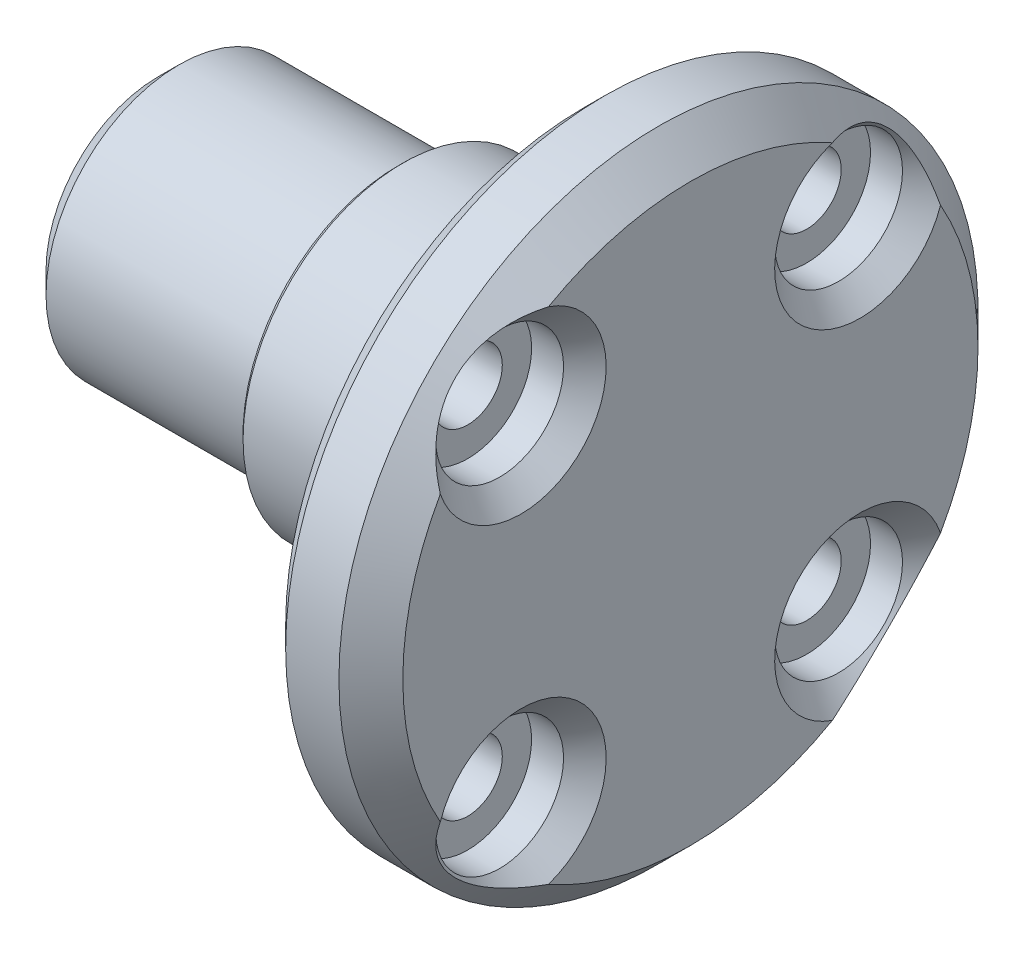
ISO-10303-21;
HEADER;
FILE_DESCRIPTION(('STEP AP214'),'2;1');
FILE_NAME('part.step','',(''),(''),'','','');
FILE_SCHEMA(('AUTOMOTIVE_DESIGN { 1 0 10303 214 1 1 1 1 }'));
ENDSEC;
DATA;
#1=APPLICATION_CONTEXT('core data for automotive mechanical design processes');
#2=APPLICATION_PROTOCOL_DEFINITION('international standard','automotive_design',2000,#1);
#3=PRODUCT_CONTEXT('',#1,'mechanical');
#4=PRODUCT('Part','Part','',(#3));
#5=PRODUCT_RELATED_PRODUCT_CATEGORY('part','',(#4));
#6=PRODUCT_DEFINITION_FORMATION('','',#4);
#7=PRODUCT_DEFINITION_CONTEXT('part definition',#1,'design');
#8=PRODUCT_DEFINITION('design','',#6,#7);
#9=PRODUCT_DEFINITION_SHAPE('','',#8);
#10=(LENGTH_UNIT() NAMED_UNIT(*) SI_UNIT(.MILLI.,.METRE.));
#11=(NAMED_UNIT(*) PLANE_ANGLE_UNIT() SI_UNIT($,.RADIAN.));
#12=(NAMED_UNIT(*) SI_UNIT($,.STERADIAN.) SOLID_ANGLE_UNIT());
#13=UNCERTAINTY_MEASURE_WITH_UNIT(LENGTH_MEASURE(1.E-05),#10,'distance_accuracy_value','');
#14=(GEOMETRIC_REPRESENTATION_CONTEXT(3) GLOBAL_UNCERTAINTY_ASSIGNED_CONTEXT((#13)) GLOBAL_UNIT_ASSIGNED_CONTEXT((#10,
#11,#12)) REPRESENTATION_CONTEXT('',''));
#15=CARTESIAN_POINT('',(0.,0.,0.));
#16=DIRECTION('',(0.,0.,1.));
#17=DIRECTION('',(1.,0.,0.));
#18=AXIS2_PLACEMENT_3D('',#15,#16,#17);
#19=CARTESIAN_POINT('',(10.,30.,0.));
#20=DIRECTION('',(-1.,0.,0.));
#21=DIRECTION('',(0.,0.,1.));
#22=AXIS2_PLACEMENT_3D('',#19,#20,#21);
#23=PLANE('',#22);
#24=CARTESIAN_POINT('',(10.,0.,0.));
#25=DIRECTION('',(-1.,0.,0.));
#26=DIRECTION('',(0.,0.,1.));
#27=AXIS2_PLACEMENT_3D('',#24,#25,#26);
#28=CIRCLE('',#27,27.);
#29=CARTESIAN_POINT('',(10.,13.3272740892088,23.4815622425575));
#30=VERTEX_POINT('',#29);
#31=CARTESIAN_POINT('',(10.,-13.3272740892088,23.4815622425575));
#32=VERTEX_POINT('',#31);
#33=EDGE_CURVE('E117',#30,#32,#28,.F.);
#34=ORIENTED_EDGE('',*,*,#33,.T.);
#35=CARTESIAN_POINT('',(10.,-15.9099025766973,15.9099025766973));
#36=DIRECTION('',(-1.,0.,0.));
#37=DIRECTION('',(0.,0.,1.));
#38=AXIS2_PLACEMENT_3D('',#35,#36,#37);
#39=CIRCLE('',#38,8.00000000000004);
#40=CARTESIAN_POINT('',(10.,-23.4815622425575,13.3272740892089));
#41=VERTEX_POINT('',#40);
#42=EDGE_CURVE('E108',#32,#41,#39,.T.);
#43=ORIENTED_EDGE('',*,*,#42,.T.);
#44=CARTESIAN_POINT('',(10.,-23.4815622425574,-13.3272740892091));
#45=VERTEX_POINT('',#44);
#46=EDGE_CURVE('E107',#41,#45,#28,.F.);
#47=ORIENTED_EDGE('',*,*,#46,.T.);
#48=CARTESIAN_POINT('',(10.,-15.9099025766972,-15.9099025766975));
#49=DIRECTION('',(-1.,0.,0.));
#50=DIRECTION('',(0.,0.,1.));
#51=AXIS2_PLACEMENT_3D('',#48,#49,#50);
#52=CIRCLE('',#51,8.00000000000006);
#53=CARTESIAN_POINT('',(10.,-13.3272740892087,-23.4815622425576));
#54=VERTEX_POINT('',#53);
#55=EDGE_CURVE('E92',#45,#54,#52,.T.);
#56=ORIENTED_EDGE('',*,*,#55,.T.);
#57=CARTESIAN_POINT('',(10.,13.3272740892088,-23.4815622425575));
#58=VERTEX_POINT('',#57);
#59=EDGE_CURVE('E104',#54,#58,#28,.F.);
#60=ORIENTED_EDGE('',*,*,#59,.T.);
#61=CARTESIAN_POINT('',(10.,15.9099025766973,-15.9099025766973));
#62=DIRECTION('',(-1.,0.,0.));
#63=DIRECTION('',(0.,0.,1.));
#64=AXIS2_PLACEMENT_3D('',#61,#62,#63);
#65=CIRCLE('',#64,8.00000000000004);
#66=CARTESIAN_POINT('',(10.,23.4815622425575,-13.3272740892089));
#67=VERTEX_POINT('',#66);
#68=EDGE_CURVE('E109',#58,#67,#65,.T.);
#69=ORIENTED_EDGE('',*,*,#68,.T.);
#70=CARTESIAN_POINT('',(10.,23.4815622425575,13.3272740892089));
#71=VERTEX_POINT('',#70);
#72=EDGE_CURVE('E116',#67,#71,#28,.F.);
#73=ORIENTED_EDGE('',*,*,#72,.T.);
#74=CARTESIAN_POINT('',(10.,15.9099025766973,15.9099025766973));
#75=DIRECTION('',(-1.,0.,0.));
#76=DIRECTION('',(0.,0.,1.));
#77=AXIS2_PLACEMENT_3D('',#74,#75,#76);
#78=CIRCLE('',#77,8.00000000000005);
#79=EDGE_CURVE('E127',#71,#30,#78,.T.);
#80=ORIENTED_EDGE('',*,*,#79,.T.);
#81=EDGE_LOOP('',(#34,#43,#47,#56,#60,#69,#73,#80));
#82=FACE_BOUND('',#81,.T.);
#83=ADVANCED_FACE('F39',(#82),#23,.F.);
#84=CARTESIAN_POINT('',(-40.,0.,0.));
#85=DIRECTION('',(1.,0.,0.));
#86=DIRECTION('',(0.,0.,-1.));
#87=AXIS2_PLACEMENT_3D('',#84,#85,#86);
#88=PLANE('',#87);
#89=CARTESIAN_POINT('',(-40.,0.,0.));
#90=DIRECTION('',(1.,0.,0.));
#91=DIRECTION('',(0.,0.,-1.));
#92=AXIS2_PLACEMENT_3D('',#89,#90,#91);
#93=CIRCLE('',#92,10.5);
#94=CARTESIAN_POINT('',(-40.,0.,-10.5));
#95=VERTEX_POINT('',#94);
#96=EDGE_CURVE('E281',#95,#95,#93,.F.);
#97=ORIENTED_EDGE('',*,*,#96,.T.);
#98=EDGE_LOOP('',(#97));
#99=FACE_BOUND('',#98,.T.);
#100=ADVANCED_FACE('F191',(#99),#88,.F.);
#101=CARTESIAN_POINT('',(-40.,0.,0.));
#102=DIRECTION('',(-1.,0.,0.));
#103=DIRECTION('',(0.,0.,1.));
#104=AXIS2_PLACEMENT_3D('',#101,#102,#103);
#105=CYLINDRICAL_SURFACE('',#104,12.5);
#106=CARTESIAN_POINT('',(-18.5,0.,0.));
#107=DIRECTION('',(1.,0.,0.));
#108=DIRECTION('',(0.,0.,-1.));
#109=AXIS2_PLACEMENT_3D('',#106,#107,#108);
#110=CIRCLE('',#109,12.5);
#111=CARTESIAN_POINT('',(-18.5,0.,-12.5));
#112=VERTEX_POINT('',#111);
#113=EDGE_CURVE('E275',#112,#112,#110,.F.);
#114=ORIENTED_EDGE('',*,*,#113,.T.);
#115=EDGE_LOOP('',(#114));
#116=FACE_BOUND('',#115,.T.);
#117=CARTESIAN_POINT('',(-38.,0.,0.));
#118=DIRECTION('',(1.,0.,0.));
#119=DIRECTION('',(0.,0.,-1.));
#120=AXIS2_PLACEMENT_3D('',#117,#118,#119);
#121=CIRCLE('',#120,12.5);
#122=CARTESIAN_POINT('',(-38.,0.,-12.5));
#123=VERTEX_POINT('',#122);
#124=EDGE_CURVE('E278',#123,#123,#121,.T.);
#125=ORIENTED_EDGE('',*,*,#124,.T.);
#126=EDGE_LOOP('',(#125));
#127=FACE_BOUND('',#126,.T.);
#128=ADVANCED_FACE('F196',(#116,#127),#105,.T.);
#129=CARTESIAN_POINT('',(-17.5,12.5,0.));
#130=DIRECTION('',(1.,0.,0.));
#131=DIRECTION('',(0.,0.,-1.));
#132=AXIS2_PLACEMENT_3D('',#129,#130,#131);
#133=PLANE('',#132);
#134=CARTESIAN_POINT('',(-17.5,0.,0.));
#135=DIRECTION('',(1.,0.,0.));
#136=DIRECTION('',(0.,0.,-1.));
#137=AXIS2_PLACEMENT_3D('',#134,#135,#136);
#138=CIRCLE('',#137,14.5);
#139=CARTESIAN_POINT('',(-17.5,0.,-14.5));
#140=VERTEX_POINT('',#139);
#141=EDGE_CURVE('E257',#140,#140,#138,.F.);
#142=ORIENTED_EDGE('',*,*,#141,.T.);
#143=EDGE_LOOP('',(#142));
#144=FACE_BOUND('',#143,.T.);
#145=CARTESIAN_POINT('',(-17.5,0.,0.));
#146=DIRECTION('',(1.,0.,0.));
#147=DIRECTION('',(0.,0.,-1.));
#148=AXIS2_PLACEMENT_3D('',#145,#146,#147);
#149=CIRCLE('',#148,13.5);
#150=CARTESIAN_POINT('',(-17.5,0.,-13.5));
#151=VERTEX_POINT('',#150);
#152=EDGE_CURVE('E272',#151,#151,#149,.T.);
#153=ORIENTED_EDGE('',*,*,#152,.T.);
#154=EDGE_LOOP('',(#153));
#155=FACE_BOUND('',#154,.T.);
#156=ADVANCED_FACE('F214',(#144,#155),#133,.F.);
#157=CARTESIAN_POINT('',(-40.,0.,0.));
#158=DIRECTION('',(-1.,0.,0.));
#159=DIRECTION('',(0.,0.,1.));
#160=AXIS2_PLACEMENT_3D('',#157,#158,#159);
#161=CYLINDRICAL_SURFACE('',#160,15.);
#162=CARTESIAN_POINT('',(-1.,0.,0.));
#163=DIRECTION('',(1.,0.,0.));
#164=DIRECTION('',(0.,0.,-1.));
#165=AXIS2_PLACEMENT_3D('',#162,#163,#164);
#166=CIRCLE('',#165,15.);
#167=CARTESIAN_POINT('',(-1.,0.,-15.));
#168=VERTEX_POINT('',#167);
#169=EDGE_CURVE('E251',#168,#168,#166,.F.);
#170=ORIENTED_EDGE('',*,*,#169,.T.);
#171=EDGE_LOOP('',(#170));
#172=FACE_BOUND('',#171,.T.);
#173=CARTESIAN_POINT('',(-17.,0.,0.));
#174=DIRECTION('',(1.,0.,0.));
#175=DIRECTION('',(0.,0.,-1.));
#176=AXIS2_PLACEMENT_3D('',#173,#174,#175);
#177=CIRCLE('',#176,15.);
#178=CARTESIAN_POINT('',(-17.,0.,-15.));
#179=VERTEX_POINT('',#178);
#180=EDGE_CURVE('E252',#179,#179,#177,.T.);
#181=ORIENTED_EDGE('',*,*,#180,.T.);
#182=EDGE_LOOP('',(#181));
#183=FACE_BOUND('',#182,.T.);
#184=ADVANCED_FACE('F210',(#172,#183),#161,.T.);
#185=CARTESIAN_POINT('',(0.,15.,0.));
#186=DIRECTION('',(1.,0.,0.));
#187=DIRECTION('',(0.,0.,-1.));
#188=AXIS2_PLACEMENT_3D('',#185,#186,#187);
#189=PLANE('',#188);
#190=CARTESIAN_POINT('',(0.,-15.9099025766972,-15.9099025766975));
#191=DIRECTION('',(1.,0.,0.));
#192=DIRECTION('',(0.,0.,-1.));
#193=AXIS2_PLACEMENT_3D('',#190,#191,#192);
#194=CIRCLE('',#193,3.25000000000001);
#195=CARTESIAN_POINT('',(0.,-15.9099025766972,-19.1599025766975));
#196=VERTEX_POINT('',#195);
#197=EDGE_CURVE('E311',#196,#196,#194,.T.);
#198=ORIENTED_EDGE('',*,*,#197,.T.);
#199=EDGE_LOOP('',(#198));
#200=FACE_BOUND('',#199,.T.);
#201=CARTESIAN_POINT('',(0.,-15.9099025766973,15.9099025766973));
#202=DIRECTION('',(1.,0.,0.));
#203=DIRECTION('',(0.,0.,-1.));
#204=AXIS2_PLACEMENT_3D('',#201,#202,#203);
#205=CIRCLE('',#204,3.25000000000001);
#206=CARTESIAN_POINT('',(0.,-15.9099025766973,12.6599025766973));
#207=VERTEX_POINT('',#206);
#208=EDGE_CURVE('E302',#207,#207,#205,.T.);
#209=ORIENTED_EDGE('',*,*,#208,.T.);
#210=EDGE_LOOP('',(#209));
#211=FACE_BOUND('',#210,.T.);
#212=CARTESIAN_POINT('',(0.,15.9099025766973,15.9099025766973));
#213=DIRECTION('',(1.,0.,0.));
#214=DIRECTION('',(0.,0.,-1.));
#215=AXIS2_PLACEMENT_3D('',#212,#213,#214);
#216=CIRCLE('',#215,3.25000000000001);
#217=CARTESIAN_POINT('',(0.,15.9099025766973,12.6599025766973));
#218=VERTEX_POINT('',#217);
#219=EDGE_CURVE('E293',#218,#218,#216,.T.);
#220=ORIENTED_EDGE('',*,*,#219,.T.);
#221=EDGE_LOOP('',(#220));
#222=FACE_BOUND('',#221,.T.);
#223=CARTESIAN_POINT('',(0.,15.9099025766973,-15.9099025766973));
#224=DIRECTION('',(1.,0.,0.));
#225=DIRECTION('',(0.,0.,-1.));
#226=AXIS2_PLACEMENT_3D('',#223,#224,#225);
#227=CIRCLE('',#226,3.25000000000001);
#228=CARTESIAN_POINT('',(0.,15.9099025766973,-19.1599025766974));
#229=VERTEX_POINT('',#228);
#230=EDGE_CURVE('E284',#229,#229,#227,.T.);
#231=ORIENTED_EDGE('',*,*,#230,.T.);
#232=EDGE_LOOP('',(#231));
#233=FACE_BOUND('',#232,.T.);
#234=CARTESIAN_POINT('',(0.,0.,0.));
#235=DIRECTION('',(1.,0.,0.));
#236=DIRECTION('',(0.,0.,-1.));
#237=AXIS2_PLACEMENT_3D('',#234,#235,#236);
#238=CIRCLE('',#237,28.);
#239=CARTESIAN_POINT('',(0.,0.,-28.));
#240=VERTEX_POINT('',#239);
#241=EDGE_CURVE('E254',#240,#240,#238,.F.);
#242=ORIENTED_EDGE('',*,*,#241,.T.);
#243=EDGE_LOOP('',(#242));
#244=FACE_BOUND('',#243,.T.);
#245=CARTESIAN_POINT('',(0.,0.,0.));
#246=DIRECTION('',(1.,0.,0.));
#247=DIRECTION('',(0.,0.,-1.));
#248=AXIS2_PLACEMENT_3D('',#245,#246,#247);
#249=CIRCLE('',#248,16.);
#250=CARTESIAN_POINT('',(0.,0.,-16.));
#251=VERTEX_POINT('',#250);
#252=EDGE_CURVE('E248',#251,#251,#249,.T.);
#253=ORIENTED_EDGE('',*,*,#252,.T.);
#254=EDGE_LOOP('',(#253));
#255=FACE_BOUND('',#254,.T.);
#256=ADVANCED_FACE('F206',(#200,#211,#222,#233,#244,#255),#189,.F.);
#257=CARTESIAN_POINT('',(-40.,0.,0.));
#258=DIRECTION('',(-1.,0.,0.));
#259=DIRECTION('',(0.,0.,1.));
#260=AXIS2_PLACEMENT_3D('',#257,#258,#259);
#261=CYLINDRICAL_SURFACE('',#260,30.);
#262=CARTESIAN_POINT('',(7.,0.,0.));
#263=DIRECTION('',(-1.,0.,0.));
#264=DIRECTION('',(0.,0.,1.));
#265=AXIS2_PLACEMENT_3D('',#262,#263,#264);
#266=CIRCLE('',#265,30.);
#267=CARTESIAN_POINT('',(7.,0.,30.));
#268=VERTEX_POINT('',#267);
#269=EDGE_CURVE('E114',#268,#268,#266,.T.);
#270=ORIENTED_EDGE('',*,*,#269,.T.);
#271=EDGE_LOOP('',(#270));
#272=FACE_BOUND('',#271,.T.);
#273=CARTESIAN_POINT('',(2.00000000000001,0.,0.));
#274=DIRECTION('',(1.,0.,0.));
#275=DIRECTION('',(0.,0.,-1.));
#276=AXIS2_PLACEMENT_3D('',#273,#274,#275);
#277=CIRCLE('',#276,30.);
#278=CARTESIAN_POINT('',(2.00000000000001,0.,-30.));
#279=VERTEX_POINT('',#278);
#280=EDGE_CURVE('E119',#279,#279,#277,.T.);
#281=ORIENTED_EDGE('',*,*,#280,.T.);
#282=EDGE_LOOP('',(#281));
#283=FACE_BOUND('',#282,.T.);
#284=ADVANCED_FACE('F202',(#272,#283),#261,.T.);
#285=CARTESIAN_POINT('',(-40.,0.,0.));
#286=DIRECTION('',(1.,0.,0.));
#287=DIRECTION('',(0.,0.,-1.));
#288=AXIS2_PLACEMENT_3D('',#285,#286,#287);
#289=CONICAL_SURFACE('',#288,10.5,0.785398163397444);
#290=ORIENTED_EDGE('',*,*,#124,.F.);
#291=EDGE_LOOP('',(#290));
#292=FACE_BOUND('',#291,.T.);
#293=ORIENTED_EDGE('',*,*,#96,.F.);
#294=EDGE_LOOP('',(#293));
#295=FACE_BOUND('',#294,.T.);
#296=ADVANCED_FACE('F205',(#292,#295),#289,.T.);
#297=CARTESIAN_POINT('',(-18.5,0.,0.));
#298=DIRECTION('',(1.,0.,0.));
#299=DIRECTION('',(0.,0.,-1.));
#300=AXIS2_PLACEMENT_3D('',#297,#298,#299);
#301=TOROIDAL_SURFACE('',#300,13.5,1.);
#302=ORIENTED_EDGE('',*,*,#152,.F.);
#303=EDGE_LOOP('',(#302));
#304=FACE_BOUND('',#303,.T.);
#305=ORIENTED_EDGE('',*,*,#113,.F.);
#306=EDGE_LOOP('',(#305));
#307=FACE_BOUND('',#306,.T.);
#308=ADVANCED_FACE('F228',(#304,#307),#301,.F.);
#309=CARTESIAN_POINT('',(-17.5,0.,0.));
#310=DIRECTION('',(1.,0.,0.));
#311=DIRECTION('',(0.,0.,-1.));
#312=AXIS2_PLACEMENT_3D('',#309,#310,#311);
#313=CONICAL_SURFACE('',#312,14.5,0.785398163397453);
#314=ORIENTED_EDGE('',*,*,#180,.F.);
#315=EDGE_LOOP('',(#314));
#316=FACE_BOUND('',#315,.T.);
#317=ORIENTED_EDGE('',*,*,#141,.F.);
#318=EDGE_LOOP('',(#317));
#319=FACE_BOUND('',#318,.T.);
#320=ADVANCED_FACE('F232',(#316,#319),#313,.T.);
#321=CARTESIAN_POINT('',(-1.,0.,0.));
#322=DIRECTION('',(1.,0.,0.));
#323=DIRECTION('',(0.,0.,-1.));
#324=AXIS2_PLACEMENT_3D('',#321,#322,#323);
#325=TOROIDAL_SURFACE('',#324,16.,1.);
#326=ORIENTED_EDGE('',*,*,#252,.F.);
#327=EDGE_LOOP('',(#326));
#328=FACE_BOUND('',#327,.T.);
#329=ORIENTED_EDGE('',*,*,#169,.F.);
#330=EDGE_LOOP('',(#329));
#331=FACE_BOUND('',#330,.T.);
#332=ADVANCED_FACE('F237',(#328,#331),#325,.F.);
#333=CARTESIAN_POINT('',(0.,0.,0.));
#334=DIRECTION('',(1.,0.,0.));
#335=DIRECTION('',(0.,0.,-1.));
#336=AXIS2_PLACEMENT_3D('',#333,#334,#335);
#337=CONICAL_SURFACE('',#336,28.,0.785398163397447);
#338=ORIENTED_EDGE('',*,*,#280,.F.);
#339=EDGE_LOOP('',(#338));
#340=FACE_BOUND('',#339,.T.);
#341=ORIENTED_EDGE('',*,*,#241,.F.);
#342=EDGE_LOOP('',(#341));
#343=FACE_BOUND('',#342,.T.);
#344=ADVANCED_FACE('F157',(#340,#343),#337,.T.);
#345=CARTESIAN_POINT('',(7.,0.,0.));
#346=DIRECTION('',(-1.,0.,0.));
#347=DIRECTION('',(0.,0.,1.));
#348=AXIS2_PLACEMENT_3D('',#345,#346,#347);
#349=CONICAL_SURFACE('',#348,30.,0.785398163397448);
#350=ORIENTED_EDGE('',*,*,#46,.F.);
#351=CARTESIAN_POINT('',(10.,-23.4815622425575,13.3272740892089));
#352=CARTESIAN_POINT('',(9.86232448607142,-23.4501261029828,13.6615809085397));
#353=CARTESIAN_POINT('',(9.72984752472203,-23.4060193855575,13.9971220723141));
#354=CARTESIAN_POINT('',(9.47709626885173,-23.2901308846258,14.6690349677454));
#355=CARTESIAN_POINT('',(9.35685572733373,-23.2182750397596,15.005406507942));
#356=CARTESIAN_POINT('',(9.13036460753321,-23.0440986978261,15.6778378924912));
#357=CARTESIAN_POINT('',(9.02421667287599,-22.9415706847328,16.0138794484206));
#358=CARTESIAN_POINT('',(8.82951571576906,-22.7044055048462,16.6793648815449));
#359=CARTESIAN_POINT('',(8.7409419766269,-22.5698065608031,17.0088161103882));
#360=CARTESIAN_POINT('',(8.60779262683494,-22.3134344018227,17.5581018946705));
#361=CARTESIAN_POINT('',(8.55803666646083,-22.2002670031246,17.7807268217918));
#362=CARTESIAN_POINT('',(8.46900493883613,-21.9577334422967,18.219120190815));
#363=CARTESIAN_POINT('',(8.42972647525074,-21.8283714603827,18.434890384135));
#364=CARTESIAN_POINT('',(8.36247319524774,-21.5541150927217,18.8570964195293));
#365=CARTESIAN_POINT('',(8.33445955120988,-21.4092762766171,19.0635621083677));
#366=CARTESIAN_POINT('',(8.2900903846555,-21.1042659036483,19.4661796679444));
#367=CARTESIAN_POINT('',(8.27373471419007,-20.9440945413953,19.6623316695423));
#368=CARTESIAN_POINT('',(8.25297821523075,-20.6086471955293,20.0434409834206));
#369=CARTESIAN_POINT('',(8.24862853474452,-20.4333098597987,20.2283471279418));
#370=CARTESIAN_POINT('',(8.25212433278745,-20.0694228288615,20.5845437957797));
#371=CARTESIAN_POINT('',(8.25996993569088,-19.8808729989254,20.7558341802167));
#372=CARTESIAN_POINT('',(8.2876950776587,-19.4920418585462,21.0836731200353));
#373=CARTESIAN_POINT('',(8.30758089190772,-19.2917544798601,21.2402139389579));
#374=CARTESIAN_POINT('',(8.35897966589651,-18.8812901088735,21.5376067757383));
#375=CARTESIAN_POINT('',(8.39049256051359,-18.6711131719697,21.678458881462));
#376=CARTESIAN_POINT('',(8.46322225710449,-18.2502598824047,21.9393150015011));
#377=CARTESIAN_POINT('',(8.50405659938735,-18.0398638868644,22.0598800270938));
#378=CARTESIAN_POINT('',(8.59529759814738,-17.6131386639475,22.2858852932752));
#379=CARTESIAN_POINT('',(8.64570405694035,-17.396809559181,22.3913258461369));
#380=CARTESIAN_POINT('',(8.75547402464071,-16.9591702576471,22.5874835389124));
#381=CARTESIAN_POINT('',(8.81485833951185,-16.7378495339617,22.6781654349591));
#382=CARTESIAN_POINT('',(8.9417252990499,-16.2920222701555,22.8448996268591));
#383=CARTESIAN_POINT('',(9.00920979304177,-16.0675150128834,22.9209485715563));
#384=CARTESIAN_POINT('',(9.18704667118001,-15.5038602181727,23.0933821941162));
#385=CARTESIAN_POINT('',(9.30198002683822,-15.163438307697,23.1809636218449));
#386=CARTESIAN_POINT('',(9.54584575101867,-14.4814174201215,23.326507286812));
#387=CARTESIAN_POINT('',(9.67477911705736,-14.1398183608298,23.3844674118181));
#388=CARTESIAN_POINT('',(9.94358682897985,-13.4601137155169,23.4728252608886));
#389=CARTESIAN_POINT('',(10.0833809907129,-13.1220001534707,23.5034073571101));
#390=CARTESIAN_POINT('',(10.3002689328825,-12.6175056752019,23.5307727053106));
#391=CARTESIAN_POINT('',(10.3736805300891,-12.4499677956788,23.5368133104256));
#392=CARTESIAN_POINT('',(10.5227811371492,-12.1157505422472,23.5430259628233));
#393=CARTESIAN_POINT('',(10.5984706720335,-11.9490713767893,23.5431966466467));
#394=CARTESIAN_POINT('',(10.6752004593753,-11.7829063540798,23.5405647490679));
#395=B_SPLINE_CURVE_WITH_KNOTS('',3,(#351,#352,#353,#354,#355,#356,#357,#358,#359,#360,#361,
#362,#363,#364,#365,#366,#367,#368,#369,#370,#371,#372,#373,#374,#375,#376,#377,#378,#379,#380,
#381,#382,#383,#384,#385,#386,#387,#388,#389,#390,#391,#392,#393,#394),.UNSPECIFIED.,.F.,.F.,(4,
2,2,2,2,2,2,2,2,2,2,2,2,2,2,2,2,2,2,2,2,4),(0.,1.08886818828535,2.18066283631679,
3.2800179474589,4.37806932271732,5.14126897214125,5.90427202580723,6.6646221388034,
7.42496260218321,8.1885373105448,8.95211980631674,9.71610061326234,10.4800771412552,
11.2170440676791,11.9539957758513,12.6926823009587,13.4315377950625,14.539275169165,
15.6470915226536,16.7473901203313,17.2963452806702,17.8454279508906),.UNSPECIFIED.);
#396=EDGE_CURVE('E97',#41,#32,#395,.T.);
#397=ORIENTED_EDGE('',*,*,#396,.T.);
#398=ORIENTED_EDGE('',*,*,#33,.F.);
#399=CARTESIAN_POINT('',(10.,13.3272740892088,23.4815622425575));
#400=CARTESIAN_POINT('',(9.86232448607142,13.6615809085396,23.4501261029828));
#401=CARTESIAN_POINT('',(9.72984752472203,13.997122072314,23.4060193855575));
#402=CARTESIAN_POINT('',(9.47709626885173,14.6690349677453,23.2901308846258));
#403=CARTESIAN_POINT('',(9.35685572733373,15.0054065079419,23.2182750397596));
#404=CARTESIAN_POINT('',(9.1303646075332,15.6778378924911,23.0440986978262));
#405=CARTESIAN_POINT('',(9.02421667287599,16.0138794484205,22.9415706847329));
#406=CARTESIAN_POINT('',(8.82951571576906,16.6793648815448,22.7044055048463));
#407=CARTESIAN_POINT('',(8.7409419766269,17.0088161103881,22.5698065608031));
#408=CARTESIAN_POINT('',(8.60779262683495,17.5581018946704,22.3134344018228));
#409=CARTESIAN_POINT('',(8.55803666646083,17.7807268217917,22.2002670031246));
#410=CARTESIAN_POINT('',(8.46900493883613,18.2191201908149,21.9577334422967));
#411=CARTESIAN_POINT('',(8.42972647525074,18.434890384135,21.8283714603827));
#412=CARTESIAN_POINT('',(8.36247319524774,18.8570964195292,21.5541150927217));
#413=CARTESIAN_POINT('',(8.33445955120987,19.0635621083676,21.4092762766172));
#414=CARTESIAN_POINT('',(8.29009038465549,19.4661796679444,21.1042659036483));
#415=CARTESIAN_POINT('',(8.27373471419007,19.6623316695423,20.9440945413954));
#416=CARTESIAN_POINT('',(8.25297821523074,20.0434409834205,20.6086471955294));
#417=CARTESIAN_POINT('',(8.24862853474452,20.2283471279417,20.4333098597987));
#418=CARTESIAN_POINT('',(8.25212433278745,20.5845437957796,20.0694228288616));
#419=CARTESIAN_POINT('',(8.25996993569088,20.7558341802166,19.8808729989255));
#420=CARTESIAN_POINT('',(8.28769507765871,21.0836731200353,19.4920418585463));
#421=CARTESIAN_POINT('',(8.30758089190772,21.2402139389579,19.2917544798601));
#422=CARTESIAN_POINT('',(8.35897966589651,21.5376067757383,18.8812901088735));
#423=CARTESIAN_POINT('',(8.39049256051359,21.6784588814619,18.6711131719697));
#424=CARTESIAN_POINT('',(8.4632222571045,21.939315001501,18.2502598824048));
#425=CARTESIAN_POINT('',(8.50405659938736,22.0598800270938,18.0398638868644));
#426=CARTESIAN_POINT('',(8.59529759814739,22.2858852932751,17.6131386639475));
#427=CARTESIAN_POINT('',(8.64570405694035,22.3913258461368,17.396809559181));
#428=CARTESIAN_POINT('',(8.75547402464071,22.5874835389123,16.9591702576471));
#429=CARTESIAN_POINT('',(8.81485833951186,22.6781654349591,16.7378495339617));
#430=CARTESIAN_POINT('',(8.94172529904991,22.844899626859,16.2920222701556));
#431=CARTESIAN_POINT('',(9.00920979304177,22.9209485715562,16.0675150128834));
#432=CARTESIAN_POINT('',(9.18704667118002,23.0933821941162,15.5038602181727));
#433=CARTESIAN_POINT('',(9.30198002683823,23.1809636218449,15.163438307697));
#434=CARTESIAN_POINT('',(9.54584575101869,23.3265072868119,14.4814174201215));
#435=CARTESIAN_POINT('',(9.67477911705737,23.3844674118181,14.1398183608299));
#436=CARTESIAN_POINT('',(9.94358682897987,23.4728252608886,13.460113715517));
#437=CARTESIAN_POINT('',(10.0833809907129,23.5034073571101,13.1220001534707));
#438=CARTESIAN_POINT('',(10.3002689328825,23.5307727053106,12.617505675202));
#439=CARTESIAN_POINT('',(10.3736805300891,23.5368133104256,12.4499677956789));
#440=CARTESIAN_POINT('',(10.5227811371492,23.5430259628233,12.1157505422472));
#441=CARTESIAN_POINT('',(10.5984706720336,23.5431966466467,11.9490713767893));
#442=CARTESIAN_POINT('',(10.6752004593753,23.5405647490679,11.7829063540798));
#443=B_SPLINE_CURVE_WITH_KNOTS('',3,(#399,#400,#401,#402,#403,#404,#405,#406,#407,#408,#409,
#410,#411,#412,#413,#414,#415,#416,#417,#418,#419,#420,#421,#422,#423,#424,#425,#426,#427,#428,
#429,#430,#431,#432,#433,#434,#435,#436,#437,#438,#439,#440,#441,#442),.UNSPECIFIED.,.F.,.F.,(4,
2,2,2,2,2,2,2,2,2,2,2,2,2,2,2,2,2,2,2,2,4),(0.,1.08886818828535,2.18066283631679,
3.28001794745892,4.37806932271734,5.14126897214126,5.90427202580725,6.66462213880343,
7.42496260218323,8.18853731054483,8.95211980631677,9.71610061326238,10.4800771412552,
11.2170440676792,11.9539957758513,12.6926823009588,13.4315377950626,14.5392751691651,
15.6470915226537,16.7473901203314,17.2963452806703,17.8454279508906),.UNSPECIFIED.);
#444=EDGE_CURVE('E133',#30,#71,#443,.T.);
#445=ORIENTED_EDGE('',*,*,#444,.T.);
#446=ORIENTED_EDGE('',*,*,#72,.F.);
#447=CARTESIAN_POINT('',(10.,23.4815622425575,-13.3272740892089));
#448=CARTESIAN_POINT('',(9.86232448607142,23.4501261029828,-13.6615809085397));
#449=CARTESIAN_POINT('',(9.72984752472203,23.4060193855575,-13.9971220723141));
#450=CARTESIAN_POINT('',(9.47709626885174,23.2901308846258,-14.6690349677454));
#451=CARTESIAN_POINT('',(9.35685572733374,23.2182750397596,-15.005406507942));
#452=CARTESIAN_POINT('',(9.13036460753321,23.0440986978261,-15.6778378924912));
#453=CARTESIAN_POINT('',(9.024216672876,22.9415706847328,-16.0138794484206));
#454=CARTESIAN_POINT('',(8.82951571576906,22.7044055048462,-16.6793648815449));
#455=CARTESIAN_POINT('',(8.74094197662691,22.5698065608031,-17.0088161103882));
#456=CARTESIAN_POINT('',(8.60779262683495,22.3134344018227,-17.5581018946705));
#457=CARTESIAN_POINT('',(8.55803666646084,22.2002670031246,-17.7807268217918));
#458=CARTESIAN_POINT('',(8.46900493883614,21.9577334422967,-18.219120190815));
#459=CARTESIAN_POINT('',(8.42972647525075,21.8283714603826,-18.434890384135));
#460=CARTESIAN_POINT('',(8.36247319524774,21.5541150927217,-18.8570964195293));
#461=CARTESIAN_POINT('',(8.33445955120988,21.4092762766171,-19.0635621083677));
#462=CARTESIAN_POINT('',(8.29009038465551,21.1042659036482,-19.4661796679445));
#463=CARTESIAN_POINT('',(8.27373471419008,20.9440945413953,-19.6623316695424));
#464=CARTESIAN_POINT('',(8.25297821523076,20.6086471955293,-20.0434409834206));
#465=CARTESIAN_POINT('',(8.24862853474454,20.4333098597986,-20.2283471279418));
#466=CARTESIAN_POINT('',(8.25212433278746,20.0694228288615,-20.5845437957797));
#467=CARTESIAN_POINT('',(8.25996993569089,19.8808729989254,-20.7558341802167));
#468=CARTESIAN_POINT('',(8.28769507765872,19.4920418585462,-21.0836731200353));
#469=CARTESIAN_POINT('',(8.30758089190773,19.29175447986,-21.240213938958));
#470=CARTESIAN_POINT('',(8.35897966589652,18.8812901088734,-21.5376067757383));
#471=CARTESIAN_POINT('',(8.39049256051361,18.6711131719696,-21.678458881462));
#472=CARTESIAN_POINT('',(8.46322225710451,18.2502598824047,-21.9393150015011));
#473=CARTESIAN_POINT('',(8.50405659938737,18.0398638868643,-22.0598800270938));
#474=CARTESIAN_POINT('',(8.5952975981474,17.6131386639474,-22.2858852932752));
#475=CARTESIAN_POINT('',(8.64570405694037,17.3968095591809,-22.3913258461369));
#476=CARTESIAN_POINT('',(8.75547402464073,16.959170257647,-22.5874835389124));
#477=CARTESIAN_POINT('',(8.81485833951188,16.7378495339616,-22.6781654349592));
#478=CARTESIAN_POINT('',(8.94172529904993,16.2920222701555,-22.8448996268591));
#479=CARTESIAN_POINT('',(9.00920979304179,16.0675150128833,-22.9209485715563));
#480=CARTESIAN_POINT('',(9.18704667118004,15.5038602181726,-23.0933821941162));
#481=CARTESIAN_POINT('',(9.30198002683825,15.1634383076969,-23.1809636218449));
#482=CARTESIAN_POINT('',(9.5458457510187,14.4814174201214,-23.326507286812));
#483=CARTESIAN_POINT('',(9.67477911705739,14.1398183608297,-23.3844674118181));
#484=CARTESIAN_POINT('',(9.94358682897989,13.4601137155168,-23.4728252608886));
#485=CARTESIAN_POINT('',(10.0833809907129,13.1220001534706,-23.5034073571101));
#486=CARTESIAN_POINT('',(10.3002689328826,12.6175056752018,-23.5307727053106));
#487=CARTESIAN_POINT('',(10.3736805300891,12.4499677956788,-23.5368133104256));
#488=CARTESIAN_POINT('',(10.5227811371493,12.1157505422471,-23.5430259628233));
#489=CARTESIAN_POINT('',(10.5984706720336,11.9490713767892,-23.5431966466467));
#490=CARTESIAN_POINT('',(10.6752004593754,11.7829063540797,-23.5405647490679));
#491=B_SPLINE_CURVE_WITH_KNOTS('',3,(#447,#448,#449,#450,#451,#452,#453,#454,#455,#456,#457,
#458,#459,#460,#461,#462,#463,#464,#465,#466,#467,#468,#469,#470,#471,#472,#473,#474,#475,#476,
#477,#478,#479,#480,#481,#482,#483,#484,#485,#486,#487,#488,#489,#490),.UNSPECIFIED.,.F.,.F.,(4,
2,2,2,2,2,2,2,2,2,2,2,2,2,2,2,2,2,2,2,2,4),(0.,1.08886818828535,2.1806628363168,
3.28001794745892,4.37806932271734,5.14126897214127,5.90427202580725,6.66462213880343,
7.42496260218323,8.18853731054484,8.95211980631678,9.71610061326238,10.4800771412552,
11.2170440676792,11.9539957758513,12.6926823009588,13.4315377950626,14.5392751691651,
15.6470915226537,16.7473901203314,17.2963452806703,17.8454279508906),.UNSPECIFIED.);
#492=EDGE_CURVE('E98',#67,#58,#491,.T.);
#493=ORIENTED_EDGE('',*,*,#492,.T.);
#494=ORIENTED_EDGE('',*,*,#59,.F.);
#495=CARTESIAN_POINT('',(10.,-13.3272740892087,-23.4815622425576));
#496=CARTESIAN_POINT('',(9.86232448607142,-13.6615809085394,-23.4501261029829));
#497=CARTESIAN_POINT('',(9.72984752472203,-13.9971220723138,-23.4060193855576));
#498=CARTESIAN_POINT('',(9.47709626885173,-14.6690349677451,-23.2901308846259));
#499=CARTESIAN_POINT('',(9.35685572733373,-15.0054065079418,-23.2182750397597));
#500=CARTESIAN_POINT('',(9.1303646075332,-15.6778378924909,-23.0440986978263));
#501=CARTESIAN_POINT('',(9.02421667287599,-16.0138794484203,-22.941570684733));
#502=CARTESIAN_POINT('',(8.82951571576905,-16.6793648815446,-22.7044055048464));
#503=CARTESIAN_POINT('',(8.7409419766269,-17.008816110388,-22.5698065608033));
#504=CARTESIAN_POINT('',(8.60779262683494,-17.5581018946702,-22.3134344018229));
#505=CARTESIAN_POINT('',(8.55803666646083,-17.7807268217916,-22.2002670031248));
#506=CARTESIAN_POINT('',(8.46900493883613,-18.2191201908148,-21.9577334422969));
#507=CARTESIAN_POINT('',(8.42972647525074,-18.4348903841348,-21.8283714603829));
#508=CARTESIAN_POINT('',(8.36247319524774,-18.8570964195291,-21.5541150927219));
#509=CARTESIAN_POINT('',(8.33445955120987,-19.0635621083675,-21.4092762766173));
#510=CARTESIAN_POINT('',(8.29009038465549,-19.4661796679442,-21.1042659036485));
#511=CARTESIAN_POINT('',(8.27373471419007,-19.6623316695421,-20.9440945413955));
#512=CARTESIAN_POINT('',(8.25297821523074,-20.0434409834204,-20.6086471955295));
#513=CARTESIAN_POINT('',(8.24862853474452,-20.2283471279416,-20.4333098597989));
#514=CARTESIAN_POINT('',(8.25212433278745,-20.5845437957795,-20.0694228288617));
#515=CARTESIAN_POINT('',(8.25996993569088,-20.7558341802165,-19.8808729989256));
#516=CARTESIAN_POINT('',(8.28769507765871,-21.0836731200351,-19.4920418585464));
#517=CARTESIAN_POINT('',(8.30758089190772,-21.2402139389578,-19.2917544798603));
#518=CARTESIAN_POINT('',(8.35897966589651,-21.5376067757381,-18.8812901088737));
#519=CARTESIAN_POINT('',(8.39049256051359,-21.6784588814618,-18.6711131719699));
#520=CARTESIAN_POINT('',(8.4632222571045,-21.9393150015009,-18.2502598824049));
#521=CARTESIAN_POINT('',(8.50405659938736,-22.0598800270936,-18.0398638868646));
#522=CARTESIAN_POINT('',(8.59529759814739,-22.285885293275,-17.6131386639477));
#523=CARTESIAN_POINT('',(8.64570405694035,-22.3913258461367,-17.3968095591812));
#524=CARTESIAN_POINT('',(8.75547402464071,-22.5874835389122,-16.9591702576473));
#525=CARTESIAN_POINT('',(8.81485833951186,-22.678165434959,-16.7378495339619));
#526=CARTESIAN_POINT('',(8.94172529904991,-22.8448996268589,-16.2920222701557));
#527=CARTESIAN_POINT('',(9.00920979304177,-22.9209485715561,-16.0675150128836));
#528=CARTESIAN_POINT('',(9.18704667118002,-23.0933821941161,-15.5038602181729));
#529=CARTESIAN_POINT('',(9.30198002683823,-23.1809636218448,-15.1634383076972));
#530=CARTESIAN_POINT('',(9.54584575101869,-23.3265072868118,-14.4814174201217));
#531=CARTESIAN_POINT('',(9.67477911705737,-23.384467411818,-14.13981836083));
#532=CARTESIAN_POINT('',(9.94358682897987,-23.4728252608885,-13.4601137155171));
#533=CARTESIAN_POINT('',(10.0833809907129,-23.50340735711,-13.1220001534709));
#534=CARTESIAN_POINT('',(10.3002689328825,-23.5307727053105,-12.6175056752021));
#535=CARTESIAN_POINT('',(10.3736805300891,-23.5368133104255,-12.449967795679));
#536=CARTESIAN_POINT('',(10.5227811371492,-23.5430259628232,-12.1157505422474));
#537=CARTESIAN_POINT('',(10.5984706720336,-23.5431966466466,-11.9490713767894));
#538=CARTESIAN_POINT('',(10.6752004593753,-23.5405647490678,-11.78290635408));
#539=B_SPLINE_CURVE_WITH_KNOTS('',3,(#495,#496,#497,#498,#499,#500,#501,#502,#503,#504,#505,
#506,#507,#508,#509,#510,#511,#512,#513,#514,#515,#516,#517,#518,#519,#520,#521,#522,#523,#524,
#525,#526,#527,#528,#529,#530,#531,#532,#533,#534,#535,#536,#537,#538),.UNSPECIFIED.,.F.,.F.,(4,
2,2,2,2,2,2,2,2,2,2,2,2,2,2,2,2,2,2,2,2,4),(0.,1.08886818828536,2.1806628363168,
3.28001794745892,4.37806932271735,5.14126897214128,5.90427202580726,6.66462213880344,
7.42496260218325,8.18853731054486,8.95211980631679,9.7161006132624,10.4800771412552,
11.2170440676792,11.9539957758513,12.6926823009588,13.4315377950626,14.5392751691651,
15.6470915226537,16.7473901203314,17.2963452806703,17.8454279508907),.UNSPECIFIED.);
#540=EDGE_CURVE('E88',#54,#45,#539,.T.);
#541=ORIENTED_EDGE('',*,*,#540,.T.);
#542=EDGE_LOOP('',(#350,#397,#398,#445,#446,#493,#494,#541));
#543=FACE_BOUND('',#542,.T.);
#544=ORIENTED_EDGE('',*,*,#269,.F.);
#545=EDGE_LOOP('',(#544));
#546=FACE_BOUND('',#545,.T.);
#547=ADVANCED_FACE('F111',(#543,#546),#349,.T.);
#548=CARTESIAN_POINT('',(10.,15.9099025766973,-15.9099025766973));
#549=DIRECTION('',(1.,0.,0.));
#550=DIRECTION('',(0.,0.,-1.));
#551=AXIS2_PLACEMENT_3D('',#548,#549,#550);
#552=CYLINDRICAL_SURFACE('',#551,3.25000000000001);
#553=ORIENTED_EDGE('',*,*,#230,.F.);
#554=EDGE_LOOP('',(#553));
#555=FACE_BOUND('',#554,.T.);
#556=CARTESIAN_POINT('',(5.,15.9099025766973,-15.9099025766973));
#557=DIRECTION('',(1.,0.,0.));
#558=DIRECTION('',(0.,0.,-1.));
#559=AXIS2_PLACEMENT_3D('',#556,#557,#558);
#560=CIRCLE('',#559,3.25000000000001);
#561=CARTESIAN_POINT('',(5.,15.9099025766973,-19.1599025766974));
#562=VERTEX_POINT('',#561);
#563=EDGE_CURVE('E287',#562,#562,#560,.T.);
#564=ORIENTED_EDGE('',*,*,#563,.T.);
#565=EDGE_LOOP('',(#564));
#566=FACE_BOUND('',#565,.T.);
#567=ADVANCED_FACE('F156',(#555,#566),#552,.F.);
#568=CARTESIAN_POINT('',(5.,19.1599025766973,-15.9099025766973));
#569=DIRECTION('',(-1.,0.,0.));
#570=DIRECTION('',(0.,0.,1.));
#571=AXIS2_PLACEMENT_3D('',#568,#569,#570);
#572=PLANE('',#571);
#573=ORIENTED_EDGE('',*,*,#563,.F.);
#574=EDGE_LOOP('',(#573));
#575=FACE_BOUND('',#574,.T.);
#576=CARTESIAN_POINT('',(5.,15.9099025766973,-15.9099025766973));
#577=DIRECTION('',(1.,0.,0.));
#578=DIRECTION('',(0.,0.,-1.));
#579=AXIS2_PLACEMENT_3D('',#576,#577,#578);
#580=CIRCLE('',#579,6.00000000000001);
#581=CARTESIAN_POINT('',(5.,15.9099025766973,-21.9099025766974));
#582=VERTEX_POINT('',#581);
#583=EDGE_CURVE('E290',#582,#582,#580,.T.);
#584=ORIENTED_EDGE('',*,*,#583,.T.);
#585=EDGE_LOOP('',(#584));
#586=FACE_BOUND('',#585,.T.);
#587=ADVANCED_FACE('F365',(#575,#586),#572,.F.);
#588=CARTESIAN_POINT('',(10.,15.9099025766973,-15.9099025766973));
#589=DIRECTION('',(1.,0.,0.));
#590=DIRECTION('',(0.,0.,-1.));
#591=AXIS2_PLACEMENT_3D('',#588,#589,#590);
#592=CYLINDRICAL_SURFACE('',#591,6.00000000000001);
#593=CARTESIAN_POINT('',(8.,15.9099025766973,-15.9099025766973));
#594=DIRECTION('',(-1.,0.,0.));
#595=DIRECTION('',(0.,0.,1.));
#596=AXIS2_PLACEMENT_3D('',#593,#594,#595);
#597=CIRCLE('',#596,6.00000000000001);
#598=CARTESIAN_POINT('',(8.,21.5886473260924,-13.972931211081));
#599=VERTEX_POINT('',#598);
#600=EDGE_CURVE('E49',#599,#599,#597,.F.);
#601=ORIENTED_EDGE('',*,*,#600,.T.);
#602=EDGE_LOOP('',(#601));
#603=FACE_BOUND('',#602,.T.);
#604=ORIENTED_EDGE('',*,*,#583,.F.);
#605=EDGE_LOOP('',(#604));
#606=FACE_BOUND('',#605,.T.);
#607=ADVANCED_FACE('F362',(#603,#606),#592,.F.);
#608=CARTESIAN_POINT('',(10.,15.9099025766973,15.9099025766973));
#609=DIRECTION('',(1.,0.,0.));
#610=DIRECTION('',(0.,0.,-1.));
#611=AXIS2_PLACEMENT_3D('',#608,#609,#610);
#612=CYLINDRICAL_SURFACE('',#611,3.25000000000001);
#613=ORIENTED_EDGE('',*,*,#219,.F.);
#614=EDGE_LOOP('',(#613));
#615=FACE_BOUND('',#614,.T.);
#616=CARTESIAN_POINT('',(5.,15.9099025766973,15.9099025766973));
#617=DIRECTION('',(1.,0.,0.));
#618=DIRECTION('',(0.,0.,-1.));
#619=AXIS2_PLACEMENT_3D('',#616,#617,#618);
#620=CIRCLE('',#619,3.25000000000001);
#621=CARTESIAN_POINT('',(5.,15.9099025766973,12.6599025766973));
#622=VERTEX_POINT('',#621);
#623=EDGE_CURVE('E296',#622,#622,#620,.T.);
#624=ORIENTED_EDGE('',*,*,#623,.T.);
#625=EDGE_LOOP('',(#624));
#626=FACE_BOUND('',#625,.T.);
#627=ADVANCED_FACE('F358',(#615,#626),#612,.F.);
#628=CARTESIAN_POINT('',(5.,19.1599025766973,15.9099025766973));
#629=DIRECTION('',(-1.,0.,0.));
#630=DIRECTION('',(0.,0.,1.));
#631=AXIS2_PLACEMENT_3D('',#628,#629,#630);
#632=PLANE('',#631);
#633=ORIENTED_EDGE('',*,*,#623,.F.);
#634=EDGE_LOOP('',(#633));
#635=FACE_BOUND('',#634,.T.);
#636=CARTESIAN_POINT('',(5.,15.9099025766973,15.9099025766973));
#637=DIRECTION('',(1.,0.,0.));
#638=DIRECTION('',(0.,0.,-1.));
#639=AXIS2_PLACEMENT_3D('',#636,#637,#638);
#640=CIRCLE('',#639,6.00000000000001);
#641=CARTESIAN_POINT('',(5.,15.9099025766973,9.90990257669733));
#642=VERTEX_POINT('',#641);
#643=EDGE_CURVE('E299',#642,#642,#640,.T.);
#644=ORIENTED_EDGE('',*,*,#643,.T.);
#645=EDGE_LOOP('',(#644));
#646=FACE_BOUND('',#645,.T.);
#647=ADVANCED_FACE('F354',(#635,#646),#632,.F.);
#648=CARTESIAN_POINT('',(10.,15.9099025766973,15.9099025766973));
#649=DIRECTION('',(1.,0.,0.));
#650=DIRECTION('',(0.,0.,-1.));
#651=AXIS2_PLACEMENT_3D('',#648,#649,#650);
#652=CYLINDRICAL_SURFACE('',#651,6.00000000000001);
#653=CARTESIAN_POINT('',(7.99999999999997,15.9099025766973,15.9099025766973));
#654=DIRECTION('',(-1.,0.,0.));
#655=DIRECTION('',(0.,0.,1.));
#656=AXIS2_PLACEMENT_3D('',#653,#654,#655);
#657=CIRCLE('',#656,6.00000000000001);
#658=CARTESIAN_POINT('',(7.99999999999997,13.9729312110809,21.5886473260925));
#659=VERTEX_POINT('',#658);
#660=EDGE_CURVE('E11',#659,#659,#657,.F.);
#661=ORIENTED_EDGE('',*,*,#660,.T.);
#662=EDGE_LOOP('',(#661));
#663=FACE_BOUND('',#662,.T.);
#664=ORIENTED_EDGE('',*,*,#643,.F.);
#665=EDGE_LOOP('',(#664));
#666=FACE_BOUND('',#665,.T.);
#667=ADVANCED_FACE('F350',(#663,#666),#652,.F.);
#668=CARTESIAN_POINT('',(10.,-15.9099025766973,15.9099025766973));
#669=DIRECTION('',(1.,0.,0.));
#670=DIRECTION('',(0.,0.,-1.));
#671=AXIS2_PLACEMENT_3D('',#668,#669,#670);
#672=CYLINDRICAL_SURFACE('',#671,3.25000000000001);
#673=ORIENTED_EDGE('',*,*,#208,.F.);
#674=EDGE_LOOP('',(#673));
#675=FACE_BOUND('',#674,.T.);
#676=CARTESIAN_POINT('',(5.,-15.9099025766973,15.9099025766973));
#677=DIRECTION('',(1.,0.,0.));
#678=DIRECTION('',(0.,0.,-1.));
#679=AXIS2_PLACEMENT_3D('',#676,#677,#678);
#680=CIRCLE('',#679,3.25000000000001);
#681=CARTESIAN_POINT('',(5.,-15.9099025766973,12.6599025766973));
#682=VERTEX_POINT('',#681);
#683=EDGE_CURVE('E305',#682,#682,#680,.T.);
#684=ORIENTED_EDGE('',*,*,#683,.T.);
#685=EDGE_LOOP('',(#684));
#686=FACE_BOUND('',#685,.T.);
#687=ADVANCED_FACE('F346',(#675,#686),#672,.F.);
#688=CARTESIAN_POINT('',(5.,-12.6599025766973,15.9099025766973));
#689=DIRECTION('',(-1.,0.,0.));
#690=DIRECTION('',(0.,0.,1.));
#691=AXIS2_PLACEMENT_3D('',#688,#689,#690);
#692=PLANE('',#691);
#693=ORIENTED_EDGE('',*,*,#683,.F.);
#694=EDGE_LOOP('',(#693));
#695=FACE_BOUND('',#694,.T.);
#696=CARTESIAN_POINT('',(5.,-15.9099025766973,15.9099025766973));
#697=DIRECTION('',(1.,0.,0.));
#698=DIRECTION('',(0.,0.,-1.));
#699=AXIS2_PLACEMENT_3D('',#696,#697,#698);
#700=CIRCLE('',#699,6.00000000000001);
#701=CARTESIAN_POINT('',(5.,-15.9099025766973,9.90990257669733));
#702=VERTEX_POINT('',#701);
#703=EDGE_CURVE('E308',#702,#702,#700,.T.);
#704=ORIENTED_EDGE('',*,*,#703,.T.);
#705=EDGE_LOOP('',(#704));
#706=FACE_BOUND('',#705,.T.);
#707=ADVANCED_FACE('F342',(#695,#706),#692,.F.);
#708=CARTESIAN_POINT('',(10.,-15.9099025766973,15.9099025766973));
#709=DIRECTION('',(1.,0.,0.));
#710=DIRECTION('',(0.,0.,-1.));
#711=AXIS2_PLACEMENT_3D('',#708,#709,#710);
#712=CYLINDRICAL_SURFACE('',#711,6.00000000000001);
#713=CARTESIAN_POINT('',(7.99999999999997,-15.9099025766973,15.9099025766973));
#714=DIRECTION('',(-1.,0.,0.));
#715=DIRECTION('',(0.,0.,1.));
#716=AXIS2_PLACEMENT_3D('',#713,#714,#715);
#717=CIRCLE('',#716,6.00000000000001);
#718=CARTESIAN_POINT('',(7.99999999999997,-21.5886473260924,13.972931211081));
#719=VERTEX_POINT('',#718);
#720=EDGE_CURVE('E123',#719,#719,#717,.F.);
#721=ORIENTED_EDGE('',*,*,#720,.T.);
#722=EDGE_LOOP('',(#721));
#723=FACE_BOUND('',#722,.T.);
#724=ORIENTED_EDGE('',*,*,#703,.F.);
#725=EDGE_LOOP('',(#724));
#726=FACE_BOUND('',#725,.T.);
#727=ADVANCED_FACE('F338',(#723,#726),#712,.F.);
#728=CARTESIAN_POINT('',(10.,-15.9099025766972,-15.9099025766975));
#729=DIRECTION('',(1.,0.,0.));
#730=DIRECTION('',(0.,0.,-1.));
#731=AXIS2_PLACEMENT_3D('',#728,#729,#730);
#732=CYLINDRICAL_SURFACE('',#731,3.25000000000001);
#733=ORIENTED_EDGE('',*,*,#197,.F.);
#734=EDGE_LOOP('',(#733));
#735=FACE_BOUND('',#734,.T.);
#736=CARTESIAN_POINT('',(5.,-15.9099025766972,-15.9099025766975));
#737=DIRECTION('',(1.,0.,0.));
#738=DIRECTION('',(0.,0.,-1.));
#739=AXIS2_PLACEMENT_3D('',#736,#737,#738);
#740=CIRCLE('',#739,3.25000000000001);
#741=CARTESIAN_POINT('',(5.,-15.9099025766972,-19.1599025766975));
#742=VERTEX_POINT('',#741);
#743=EDGE_CURVE('E314',#742,#742,#740,.T.);
#744=ORIENTED_EDGE('',*,*,#743,.T.);
#745=EDGE_LOOP('',(#744));
#746=FACE_BOUND('',#745,.T.);
#747=ADVANCED_FACE('F331',(#735,#746),#732,.F.);
#748=CARTESIAN_POINT('',(5.,-12.6599025766972,-15.9099025766975));
#749=DIRECTION('',(-1.,0.,0.));
#750=DIRECTION('',(0.,0.,1.));
#751=AXIS2_PLACEMENT_3D('',#748,#749,#750);
#752=PLANE('',#751);
#753=ORIENTED_EDGE('',*,*,#743,.F.);
#754=EDGE_LOOP('',(#753));
#755=FACE_BOUND('',#754,.T.);
#756=CARTESIAN_POINT('',(5.,-15.9099025766972,-15.9099025766975));
#757=DIRECTION('',(1.,0.,0.));
#758=DIRECTION('',(0.,0.,-1.));
#759=AXIS2_PLACEMENT_3D('',#756,#757,#758);
#760=CIRCLE('',#759,6.00000000000001);
#761=CARTESIAN_POINT('',(5.,-15.9099025766972,-21.9099025766975));
#762=VERTEX_POINT('',#761);
#763=EDGE_CURVE('E317',#762,#762,#760,.T.);
#764=ORIENTED_EDGE('',*,*,#763,.T.);
#765=EDGE_LOOP('',(#764));
#766=FACE_BOUND('',#765,.T.);
#767=ADVANCED_FACE('F321',(#755,#766),#752,.F.);
#768=CARTESIAN_POINT('',(10.,-15.9099025766972,-15.9099025766975));
#769=DIRECTION('',(1.,0.,0.));
#770=DIRECTION('',(0.,0.,-1.));
#771=AXIS2_PLACEMENT_3D('',#768,#769,#770);
#772=CYLINDRICAL_SURFACE('',#771,6.00000000000001);
#773=CARTESIAN_POINT('',(7.99999999999997,-15.9099025766972,-15.9099025766975));
#774=DIRECTION('',(-1.,0.,0.));
#775=DIRECTION('',(0.,0.,1.));
#776=AXIS2_PLACEMENT_3D('',#773,#774,#775);
#777=CIRCLE('',#776,6.00000000000001);
#778=CARTESIAN_POINT('',(7.99999999999997,-13.9729312110808,-21.5886473260926));
#779=VERTEX_POINT('',#778);
#780=EDGE_CURVE('E602',#779,#779,#777,.F.);
#781=ORIENTED_EDGE('',*,*,#780,.T.);
#782=EDGE_LOOP('',(#781));
#783=FACE_BOUND('',#782,.T.);
#784=ORIENTED_EDGE('',*,*,#763,.F.);
#785=EDGE_LOOP('',(#784));
#786=FACE_BOUND('',#785,.T.);
#787=ADVANCED_FACE('F323',(#783,#786),#772,.F.);
#788=CARTESIAN_POINT('',(7.99999999999997,-15.9099025766973,15.9099025766973));
#789=DIRECTION('',(1.,0.,0.));
#790=DIRECTION('',(0.,0.,-1.));
#791=AXIS2_PLACEMENT_3D('',#788,#789,#790);
#792=CONICAL_SURFACE('',#791,6.00000000000001,0.785398163397446);
#793=ORIENTED_EDGE('',*,*,#396,.F.);
#794=ORIENTED_EDGE('',*,*,#42,.F.);
#795=EDGE_LOOP('',(#793,#794));
#796=FACE_BOUND('',#795,.T.);
#797=ORIENTED_EDGE('',*,*,#720,.F.);
#798=EDGE_LOOP('',(#797));
#799=FACE_BOUND('',#798,.T.);
#800=ADVANCED_FACE('F131',(#796,#799),#792,.F.);
#801=CARTESIAN_POINT('',(7.99999999999997,-15.9099025766972,-15.9099025766975));
#802=DIRECTION('',(1.,0.,0.));
#803=DIRECTION('',(0.,0.,-1.));
#804=AXIS2_PLACEMENT_3D('',#801,#802,#803);
#805=CONICAL_SURFACE('',#804,6.00000000000001,0.785398163397452);
#806=ORIENTED_EDGE('',*,*,#540,.F.);
#807=ORIENTED_EDGE('',*,*,#55,.F.);
#808=EDGE_LOOP('',(#806,#807));
#809=FACE_BOUND('',#808,.T.);
#810=ORIENTED_EDGE('',*,*,#780,.F.);
#811=EDGE_LOOP('',(#810));
#812=FACE_BOUND('',#811,.T.);
#813=ADVANCED_FACE('F90',(#809,#812),#805,.F.);
#814=CARTESIAN_POINT('',(8.,15.9099025766973,-15.9099025766973));
#815=DIRECTION('',(1.,0.,0.));
#816=DIRECTION('',(0.,0.,-1.));
#817=AXIS2_PLACEMENT_3D('',#814,#815,#816);
#818=CONICAL_SURFACE('',#817,6.00000000000001,0.785398163397453);
#819=ORIENTED_EDGE('',*,*,#492,.F.);
#820=ORIENTED_EDGE('',*,*,#68,.F.);
#821=EDGE_LOOP('',(#819,#820));
#822=FACE_BOUND('',#821,.T.);
#823=ORIENTED_EDGE('',*,*,#600,.F.);
#824=EDGE_LOOP('',(#823));
#825=FACE_BOUND('',#824,.T.);
#826=ADVANCED_FACE('F180',(#822,#825),#818,.F.);
#827=CARTESIAN_POINT('',(7.99999999999997,15.9099025766973,15.9099025766973));
#828=DIRECTION('',(1.,0.,0.));
#829=DIRECTION('',(0.,0.,-1.));
#830=AXIS2_PLACEMENT_3D('',#827,#828,#829);
#831=CONICAL_SURFACE('',#830,6.00000000000001,0.78539816339745);
#832=ORIENTED_EDGE('',*,*,#444,.F.);
#833=ORIENTED_EDGE('',*,*,#79,.F.);
#834=EDGE_LOOP('',(#832,#833));
#835=FACE_BOUND('',#834,.T.);
#836=ORIENTED_EDGE('',*,*,#660,.F.);
#837=EDGE_LOOP('',(#836));
#838=FACE_BOUND('',#837,.T.);
#839=ADVANCED_FACE('F42',(#835,#838),#831,.F.);
#840=CLOSED_SHELL('',(#83,#100,#128,#156,#184,#256,#284,#296,#308,#320,#332,#344,#547,#567,#587,
#607,#627,#647,#667,#687,#707,#727,#747,#767,#787,#800,#813,#826,#839));
#841=MANIFOLD_SOLID_BREP('B2',#840);
#842=ADVANCED_BREP_SHAPE_REPRESENTATION('',(#18,#841),#14);
#843=SHAPE_DEFINITION_REPRESENTATION(#9,#842);
ENDSEC;
END-ISO-10303-21;
